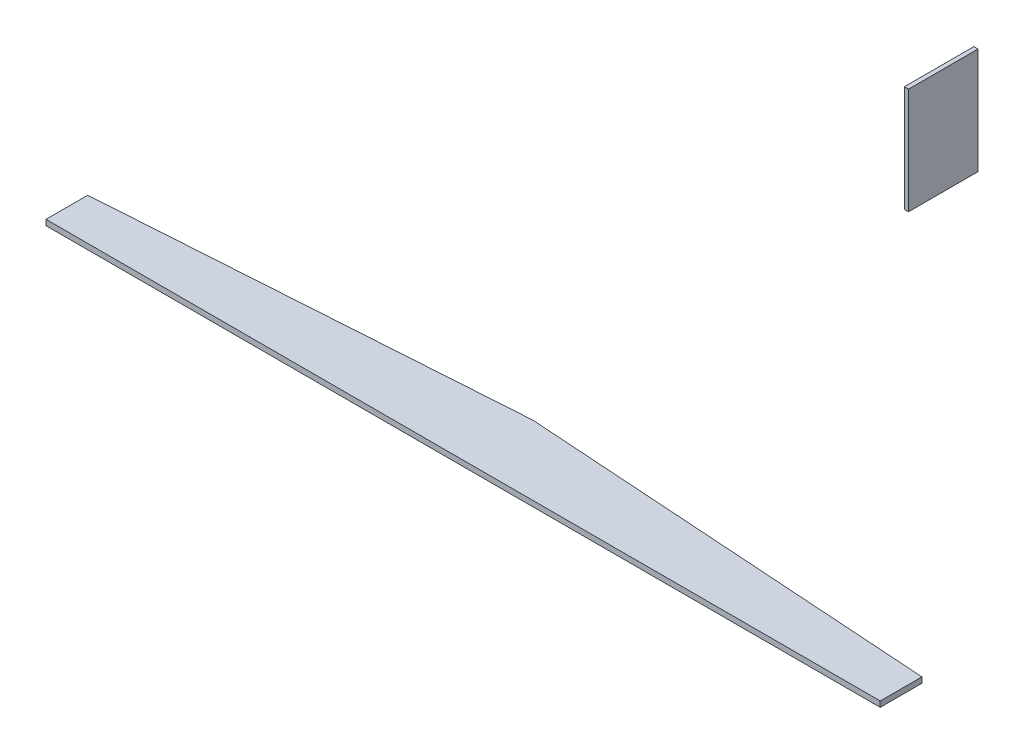
ISO-10303-21;
HEADER;
FILE_DESCRIPTION(('STEP AP214'),'2;1');
FILE_NAME('part.step','',(''),(''),'','','');
FILE_SCHEMA(('AUTOMOTIVE_DESIGN { 1 0 10303 214 1 1 1 1 }'));
ENDSEC;
DATA;
#1=APPLICATION_CONTEXT('core data for automotive mechanical design processes');
#2=APPLICATION_PROTOCOL_DEFINITION('international standard','automotive_design',2000,#1);
#3=PRODUCT_CONTEXT('',#1,'mechanical');
#4=PRODUCT('Part','Part','',(#3));
#5=PRODUCT_RELATED_PRODUCT_CATEGORY('part','',(#4));
#6=PRODUCT_DEFINITION_FORMATION('','',#4);
#7=PRODUCT_DEFINITION_CONTEXT('part definition',#1,'design');
#8=PRODUCT_DEFINITION('design','',#6,#7);
#9=PRODUCT_DEFINITION_SHAPE('','',#8);
#10=(LENGTH_UNIT() NAMED_UNIT(*) SI_UNIT(.MILLI.,.METRE.));
#11=(NAMED_UNIT(*) PLANE_ANGLE_UNIT() SI_UNIT($,.RADIAN.));
#12=(NAMED_UNIT(*) SI_UNIT($,.STERADIAN.) SOLID_ANGLE_UNIT());
#13=UNCERTAINTY_MEASURE_WITH_UNIT(LENGTH_MEASURE(1.E-05),#10,'distance_accuracy_value','');
#14=(GEOMETRIC_REPRESENTATION_CONTEXT(3) GLOBAL_UNCERTAINTY_ASSIGNED_CONTEXT((#13)) GLOBAL_UNIT_ASSIGNED_CONTEXT((#10,
#11,#12)) REPRESENTATION_CONTEXT('',''));
#15=CARTESIAN_POINT('',(0.,0.,0.));
#16=DIRECTION('',(0.,0.,1.));
#17=DIRECTION('',(1.,0.,0.));
#18=AXIS2_PLACEMENT_3D('',#15,#16,#17);
#19=CARTESIAN_POINT('',(-7.49999999999972,382.,-1500.));
#20=DIRECTION('',(1.,0.,0.));
#21=DIRECTION('',(0.,0.,-1.));
#22=AXIS2_PLACEMENT_3D('',#19,#20,#21);
#23=PLANE('',#22);
#24=DIRECTION('',(0.,0.,1.));
#25=VECTOR('',#24,1.);
#26=CARTESIAN_POINT('',(-7.49999999999972,0.,-1500.));
#27=LINE('',#26,#25);
#28=CARTESIAN_POINT('',(-7.5,0.,-1750.));
#29=VERTEX_POINT('',#28);
#30=CARTESIAN_POINT('',(-7.49999999999972,0.,-1500.));
#31=VERTEX_POINT('',#30);
#32=EDGE_CURVE('E108',#29,#31,#27,.T.);
#33=ORIENTED_EDGE('',*,*,#32,.T.);
#34=DIRECTION('',(0.,-1.,0.));
#35=VECTOR('',#34,1.);
#36=CARTESIAN_POINT('',(-7.49999999999972,382.,-1500.));
#37=LINE('',#36,#35);
#38=CARTESIAN_POINT('',(-7.49999999999972,382.,-1500.));
#39=VERTEX_POINT('',#38);
#40=EDGE_CURVE('E12',#39,#31,#37,.T.);
#41=ORIENTED_EDGE('',*,*,#40,.F.);
#42=DIRECTION('',(0.,0.,1.));
#43=VECTOR('',#42,1.);
#44=CARTESIAN_POINT('',(-7.49999999999972,382.,-1500.));
#45=LINE('',#44,#43);
#46=CARTESIAN_POINT('',(-7.5,382.,-1750.));
#47=VERTEX_POINT('',#46);
#48=EDGE_CURVE('E96',#47,#39,#45,.T.);
#49=ORIENTED_EDGE('',*,*,#48,.F.);
#50=DIRECTION('',(0.,-1.,0.));
#51=VECTOR('',#50,1.);
#52=CARTESIAN_POINT('',(-7.5,382.,-1750.));
#53=LINE('',#52,#51);
#54=EDGE_CURVE('E104',#47,#29,#53,.T.);
#55=ORIENTED_EDGE('',*,*,#54,.T.);
#56=EDGE_LOOP('',(#33,#41,#49,#55));
#57=FACE_BOUND('',#56,.T.);
#58=ADVANCED_FACE('F45',(#57),#23,.F.);
#59=CARTESIAN_POINT('',(-7.49999999999972,382.,-1500.));
#60=DIRECTION('',(0.,0.,-1.));
#61=DIRECTION('',(-1.,0.,0.));
#62=AXIS2_PLACEMENT_3D('',#59,#60,#61);
#63=PLANE('',#62);
#64=DIRECTION('',(1.,0.,0.));
#65=VECTOR('',#64,1.);
#66=CARTESIAN_POINT('',(-7.49999999999972,0.,-1500.));
#67=LINE('',#66,#65);
#68=CARTESIAN_POINT('',(7.49999999999972,0.,-1500.));
#69=VERTEX_POINT('',#68);
#70=EDGE_CURVE('E100',#31,#69,#67,.T.);
#71=ORIENTED_EDGE('',*,*,#70,.T.);
#72=DIRECTION('',(0.,-1.,0.));
#73=VECTOR('',#72,1.);
#74=CARTESIAN_POINT('',(7.49999999999972,382.,-1500.));
#75=LINE('',#74,#73);
#76=CARTESIAN_POINT('',(7.49999999999972,382.,-1500.));
#77=VERTEX_POINT('',#76);
#78=EDGE_CURVE('E53',#77,#69,#75,.T.);
#79=ORIENTED_EDGE('',*,*,#78,.F.);
#80=DIRECTION('',(1.,0.,0.));
#81=VECTOR('',#80,1.);
#82=CARTESIAN_POINT('',(-7.49999999999972,382.,-1500.));
#83=LINE('',#82,#81);
#84=EDGE_CURVE('E91',#39,#77,#83,.T.);
#85=ORIENTED_EDGE('',*,*,#84,.F.);
#86=ORIENTED_EDGE('',*,*,#40,.T.);
#87=EDGE_LOOP('',(#71,#79,#85,#86));
#88=FACE_BOUND('',#87,.T.);
#89=ADVANCED_FACE('F99',(#88),#63,.F.);
#90=CARTESIAN_POINT('',(7.49999999999972,382.,-1500.));
#91=DIRECTION('',(-1.,0.,0.));
#92=DIRECTION('',(0.,0.,1.));
#93=AXIS2_PLACEMENT_3D('',#90,#91,#92);
#94=PLANE('',#93);
#95=DIRECTION('',(0.,0.,-1.));
#96=VECTOR('',#95,1.);
#97=CARTESIAN_POINT('',(7.49999999999972,0.,-1500.));
#98=LINE('',#97,#96);
#99=CARTESIAN_POINT('',(7.5,0.,-1750.));
#100=VERTEX_POINT('',#99);
#101=EDGE_CURVE('E78',#69,#100,#98,.T.);
#102=ORIENTED_EDGE('',*,*,#101,.T.);
#103=DIRECTION('',(0.,-1.,0.));
#104=VECTOR('',#103,1.);
#105=CARTESIAN_POINT('',(7.5,382.,-1750.));
#106=LINE('',#105,#104);
#107=CARTESIAN_POINT('',(7.5,382.,-1750.));
#108=VERTEX_POINT('',#107);
#109=EDGE_CURVE('E101',#108,#100,#106,.T.);
#110=ORIENTED_EDGE('',*,*,#109,.F.);
#111=DIRECTION('',(0.,0.,-1.));
#112=VECTOR('',#111,1.);
#113=CARTESIAN_POINT('',(7.49999999999972,382.,-1500.));
#114=LINE('',#113,#112);
#115=EDGE_CURVE('E94',#77,#108,#114,.T.);
#116=ORIENTED_EDGE('',*,*,#115,.F.);
#117=ORIENTED_EDGE('',*,*,#78,.T.);
#118=EDGE_LOOP('',(#102,#110,#116,#117));
#119=FACE_BOUND('',#118,.T.);
#120=ADVANCED_FACE('F102',(#119),#94,.F.);
#121=CARTESIAN_POINT('',(-7.5,382.,-1750.));
#122=DIRECTION('',(0.,0.,1.));
#123=DIRECTION('',(1.,0.,0.));
#124=AXIS2_PLACEMENT_3D('',#121,#122,#123);
#125=PLANE('',#124);
#126=DIRECTION('',(-1.,0.,0.));
#127=VECTOR('',#126,1.);
#128=CARTESIAN_POINT('',(-7.5,0.,-1750.));
#129=LINE('',#128,#127);
#130=EDGE_CURVE('E84',#100,#29,#129,.T.);
#131=ORIENTED_EDGE('',*,*,#130,.T.);
#132=ORIENTED_EDGE('',*,*,#54,.F.);
#133=DIRECTION('',(-1.,0.,0.));
#134=VECTOR('',#133,1.);
#135=CARTESIAN_POINT('',(-7.5,382.,-1750.));
#136=LINE('',#135,#134);
#137=EDGE_CURVE('E61',#108,#47,#136,.T.);
#138=ORIENTED_EDGE('',*,*,#137,.F.);
#139=ORIENTED_EDGE('',*,*,#109,.T.);
#140=EDGE_LOOP('',(#131,#132,#138,#139));
#141=FACE_BOUND('',#140,.T.);
#142=ADVANCED_FACE('F115',(#141),#125,.F.);
#143=CARTESIAN_POINT('',(0.,382.,0.));
#144=DIRECTION('',(0.,-1.,0.));
#145=DIRECTION('',(0.,0.,-1.));
#146=AXIS2_PLACEMENT_3D('',#143,#144,#145);
#147=PLANE('',#146);
#148=ORIENTED_EDGE('',*,*,#48,.T.);
#149=ORIENTED_EDGE('',*,*,#84,.T.);
#150=ORIENTED_EDGE('',*,*,#115,.T.);
#151=ORIENTED_EDGE('',*,*,#137,.T.);
#152=EDGE_LOOP('',(#148,#149,#150,#151));
#153=FACE_BOUND('',#152,.T.);
#154=ADVANCED_FACE('F92',(#153),#147,.F.);
#155=CARTESIAN_POINT('',(0.,0.,0.));
#156=DIRECTION('',(0.,-1.,0.));
#157=DIRECTION('',(0.,0.,-1.));
#158=AXIS2_PLACEMENT_3D('',#155,#156,#157);
#159=PLANE('',#158);
#160=ORIENTED_EDGE('',*,*,#32,.F.);
#161=ORIENTED_EDGE('',*,*,#130,.F.);
#162=ORIENTED_EDGE('',*,*,#101,.F.);
#163=ORIENTED_EDGE('',*,*,#70,.F.);
#164=EDGE_LOOP('',(#160,#161,#162,#163));
#165=FACE_BOUND('',#164,.T.);
#166=ADVANCED_FACE('F118',(#165),#159,.T.);
#167=CLOSED_SHELL('',(#58,#89,#120,#142,#154,#166));
#168=MANIFOLD_SOLID_BREP('B2',#167);
#169=CARTESIAN_POINT('',(0.,20.,-155.905956273834));
#170=DIRECTION('',(0.0665190105237741,0.,0.997785157856609));
#171=DIRECTION('',(0.997785157856609,0.,-0.0665190105237741));
#172=AXIS2_PLACEMENT_3D('',#169,#170,#171);
#173=PLANE('',#172);
#174=DIRECTION('',(-0.997785157856609,0.,0.0665190105237741));
#175=VECTOR('',#174,1.);
#176=CARTESIAN_POINT('',(0.,0.,-155.905956273834));
#177=LINE('',#176,#175);
#178=CARTESIAN_POINT('',(0.,0.,-155.905956273834));
#179=VERTEX_POINT('',#178);
#180=CARTESIAN_POINT('',(-1500.,0.,-55.9059562738334));
#181=VERTEX_POINT('',#180);
#182=EDGE_CURVE('E198',#179,#181,#177,.T.);
#183=ORIENTED_EDGE('',*,*,#182,.T.);
#184=DIRECTION('',(0.,-1.,0.));
#185=VECTOR('',#184,1.);
#186=CARTESIAN_POINT('',(-1500.,20.,-55.9059562738334));
#187=LINE('',#186,#185);
#188=CARTESIAN_POINT('',(-1500.,20.,-55.9059562738334));
#189=VERTEX_POINT('',#188);
#190=EDGE_CURVE('E177',#189,#181,#187,.T.);
#191=ORIENTED_EDGE('',*,*,#190,.F.);
#192=DIRECTION('',(-0.997785157856609,0.,0.0665190105237741));
#193=VECTOR('',#192,1.);
#194=CARTESIAN_POINT('',(0.,20.,-155.905956273834));
#195=LINE('',#194,#193);
#196=CARTESIAN_POINT('',(0.,20.,-155.905956273834));
#197=VERTEX_POINT('',#196);
#198=EDGE_CURVE('E206',#197,#189,#195,.T.);
#199=ORIENTED_EDGE('',*,*,#198,.F.);
#200=DIRECTION('',(0.,-1.,0.));
#201=VECTOR('',#200,1.);
#202=CARTESIAN_POINT('',(0.,20.,-155.905956273834));
#203=LINE('',#202,#201);
#204=EDGE_CURVE('E43',#197,#179,#203,.T.);
#205=ORIENTED_EDGE('',*,*,#204,.T.);
#206=EDGE_LOOP('',(#183,#191,#199,#205));
#207=FACE_BOUND('',#206,.T.);
#208=ADVANCED_FACE('F169',(#207),#173,.F.);
#209=CARTESIAN_POINT('',(-1500.,20.,94.0940437261666));
#210=DIRECTION('',(1.,0.,0.));
#211=DIRECTION('',(0.,0.,-1.));
#212=AXIS2_PLACEMENT_3D('',#209,#210,#211);
#213=PLANE('',#212);
#214=DIRECTION('',(0.,0.,1.));
#215=VECTOR('',#214,1.);
#216=CARTESIAN_POINT('',(-1500.,0.,94.0940437261666));
#217=LINE('',#216,#215);
#218=CARTESIAN_POINT('',(-1500.,0.,94.0940437261666));
#219=VERTEX_POINT('',#218);
#220=EDGE_CURVE('E203',#181,#219,#217,.T.);
#221=ORIENTED_EDGE('',*,*,#220,.T.);
#222=DIRECTION('',(0.,-1.,0.));
#223=VECTOR('',#222,1.);
#224=CARTESIAN_POINT('',(-1500.,20.,94.0940437261666));
#225=LINE('',#224,#223);
#226=CARTESIAN_POINT('',(-1500.,20.,94.0940437261666));
#227=VERTEX_POINT('',#226);
#228=EDGE_CURVE('E228',#227,#219,#225,.T.);
#229=ORIENTED_EDGE('',*,*,#228,.F.);
#230=DIRECTION('',(0.,0.,1.));
#231=VECTOR('',#230,1.);
#232=CARTESIAN_POINT('',(-1500.,20.,94.0940437261666));
#233=LINE('',#232,#231);
#234=EDGE_CURVE('E185',#189,#227,#233,.T.);
#235=ORIENTED_EDGE('',*,*,#234,.F.);
#236=ORIENTED_EDGE('',*,*,#190,.T.);
#237=EDGE_LOOP('',(#221,#229,#235,#236));
#238=FACE_BOUND('',#237,.T.);
#239=ADVANCED_FACE('F256',(#238),#213,.F.);
#240=CARTESIAN_POINT('',(0.,20.,94.0940437261664));
#241=DIRECTION('',(0.,0.,-1.));
#242=DIRECTION('',(-1.,0.,0.));
#243=AXIS2_PLACEMENT_3D('',#240,#241,#242);
#244=PLANE('',#243);
#245=DIRECTION('',(1.,0.,0.));
#246=VECTOR('',#245,1.);
#247=CARTESIAN_POINT('',(0.,0.,94.0940437261664));
#248=LINE('',#247,#246);
#249=CARTESIAN_POINT('',(1500.,0.,94.0940437261666));
#250=VERTEX_POINT('',#249);
#251=EDGE_CURVE('E234',#219,#250,#248,.T.);
#252=ORIENTED_EDGE('',*,*,#251,.T.);
#253=DIRECTION('',(0.,-1.,0.));
#254=VECTOR('',#253,1.);
#255=CARTESIAN_POINT('',(1500.,20.,94.0940437261666));
#256=LINE('',#255,#254);
#257=CARTESIAN_POINT('',(1500.,20.,94.0940437261666));
#258=VERTEX_POINT('',#257);
#259=EDGE_CURVE('E231',#258,#250,#256,.T.);
#260=ORIENTED_EDGE('',*,*,#259,.F.);
#261=DIRECTION('',(1.,0.,0.));
#262=VECTOR('',#261,1.);
#263=CARTESIAN_POINT('',(0.,20.,94.0940437261664));
#264=LINE('',#263,#262);
#265=EDGE_CURVE('E220',#227,#258,#264,.T.);
#266=ORIENTED_EDGE('',*,*,#265,.F.);
#267=ORIENTED_EDGE('',*,*,#228,.T.);
#268=EDGE_LOOP('',(#252,#260,#266,#267));
#269=FACE_BOUND('',#268,.T.);
#270=ADVANCED_FACE('F232',(#269),#244,.F.);
#271=CARTESIAN_POINT('',(0.,20.,0.));
#272=DIRECTION('',(0.,1.,0.));
#273=DIRECTION('',(0.,0.,1.));
#274=AXIS2_PLACEMENT_3D('',#271,#272,#273);
#275=PLANE('',#274);
#276=ORIENTED_EDGE('',*,*,#265,.T.);
#277=DIRECTION('',(0.,0.,1.));
#278=VECTOR('',#277,1.);
#279=CARTESIAN_POINT('',(1500.,20.,94.0940437261666));
#280=LINE('',#279,#278);
#281=CARTESIAN_POINT('',(1500.,20.,-55.9059562738334));
#282=VERTEX_POINT('',#281);
#283=EDGE_CURVE('E225',#282,#258,#280,.T.);
#284=ORIENTED_EDGE('',*,*,#283,.F.);
#285=DIRECTION('',(0.997785157856609,0.,0.0665190105237741));
#286=VECTOR('',#285,1.);
#287=CARTESIAN_POINT('',(0.,20.,-155.905956273834));
#288=LINE('',#287,#286);
#289=EDGE_CURVE('E241',#197,#282,#288,.T.);
#290=ORIENTED_EDGE('',*,*,#289,.F.);
#291=ORIENTED_EDGE('',*,*,#198,.T.);
#292=ORIENTED_EDGE('',*,*,#234,.T.);
#293=EDGE_LOOP('',(#276,#284,#290,#291,#292));
#294=FACE_BOUND('',#293,.T.);
#295=ADVANCED_FACE('F222',(#294),#275,.T.);
#296=CARTESIAN_POINT('',(0.,0.,0.));
#297=DIRECTION('',(0.,1.,0.));
#298=DIRECTION('',(0.,0.,1.));
#299=AXIS2_PLACEMENT_3D('',#296,#297,#298);
#300=PLANE('',#299);
#301=ORIENTED_EDGE('',*,*,#182,.F.);
#302=DIRECTION('',(0.997785157856609,0.,0.0665190105237741));
#303=VECTOR('',#302,1.);
#304=CARTESIAN_POINT('',(0.,0.,-155.905956273834));
#305=LINE('',#304,#303);
#306=CARTESIAN_POINT('',(1500.,0.,-55.9059562738334));
#307=VERTEX_POINT('',#306);
#308=EDGE_CURVE('E242',#179,#307,#305,.T.);
#309=ORIENTED_EDGE('',*,*,#308,.T.);
#310=DIRECTION('',(0.,0.,1.));
#311=VECTOR('',#310,1.);
#312=CARTESIAN_POINT('',(1500.,0.,94.0940437261666));
#313=LINE('',#312,#311);
#314=EDGE_CURVE('E246',#307,#250,#313,.T.);
#315=ORIENTED_EDGE('',*,*,#314,.T.);
#316=ORIENTED_EDGE('',*,*,#251,.F.);
#317=ORIENTED_EDGE('',*,*,#220,.F.);
#318=EDGE_LOOP('',(#301,#309,#315,#316,#317));
#319=FACE_BOUND('',#318,.T.);
#320=ADVANCED_FACE('F258',(#319),#300,.F.);
#321=CARTESIAN_POINT('',(1500.,20.,94.0940437261666));
#322=DIRECTION('',(1.,0.,0.));
#323=DIRECTION('',(0.,0.,-1.));
#324=AXIS2_PLACEMENT_3D('',#321,#322,#323);
#325=PLANE('',#324);
#326=ORIENTED_EDGE('',*,*,#314,.F.);
#327=DIRECTION('',(0.,-1.,0.));
#328=VECTOR('',#327,1.);
#329=CARTESIAN_POINT('',(1500.,20.,-55.9059562738334));
#330=LINE('',#329,#328);
#331=EDGE_CURVE('E238',#282,#307,#330,.T.);
#332=ORIENTED_EDGE('',*,*,#331,.F.);
#333=ORIENTED_EDGE('',*,*,#283,.T.);
#334=ORIENTED_EDGE('',*,*,#259,.T.);
#335=EDGE_LOOP('',(#326,#332,#333,#334));
#336=FACE_BOUND('',#335,.T.);
#337=ADVANCED_FACE('F240',(#336),#325,.T.);
#338=CARTESIAN_POINT('',(0.,20.,-155.905956273834));
#339=DIRECTION('',(0.0665190105237741,0.,-0.997785157856609));
#340=DIRECTION('',(-0.997785157856609,0.,-0.0665190105237741));
#341=AXIS2_PLACEMENT_3D('',#338,#339,#340);
#342=PLANE('',#341);
#343=ORIENTED_EDGE('',*,*,#308,.F.);
#344=ORIENTED_EDGE('',*,*,#204,.F.);
#345=ORIENTED_EDGE('',*,*,#289,.T.);
#346=ORIENTED_EDGE('',*,*,#331,.T.);
#347=EDGE_LOOP('',(#343,#344,#345,#346));
#348=FACE_BOUND('',#347,.T.);
#349=ADVANCED_FACE('F261',(#348),#342,.T.);
#350=CLOSED_SHELL('',(#208,#239,#270,#295,#320,#337,#349));
#351=MANIFOLD_SOLID_BREP('B6',#350);
#352=ADVANCED_BREP_SHAPE_REPRESENTATION('',(#18,#168,#351),#14);
#353=SHAPE_DEFINITION_REPRESENTATION(#9,#352);
ENDSEC;
END-ISO-10303-21;
